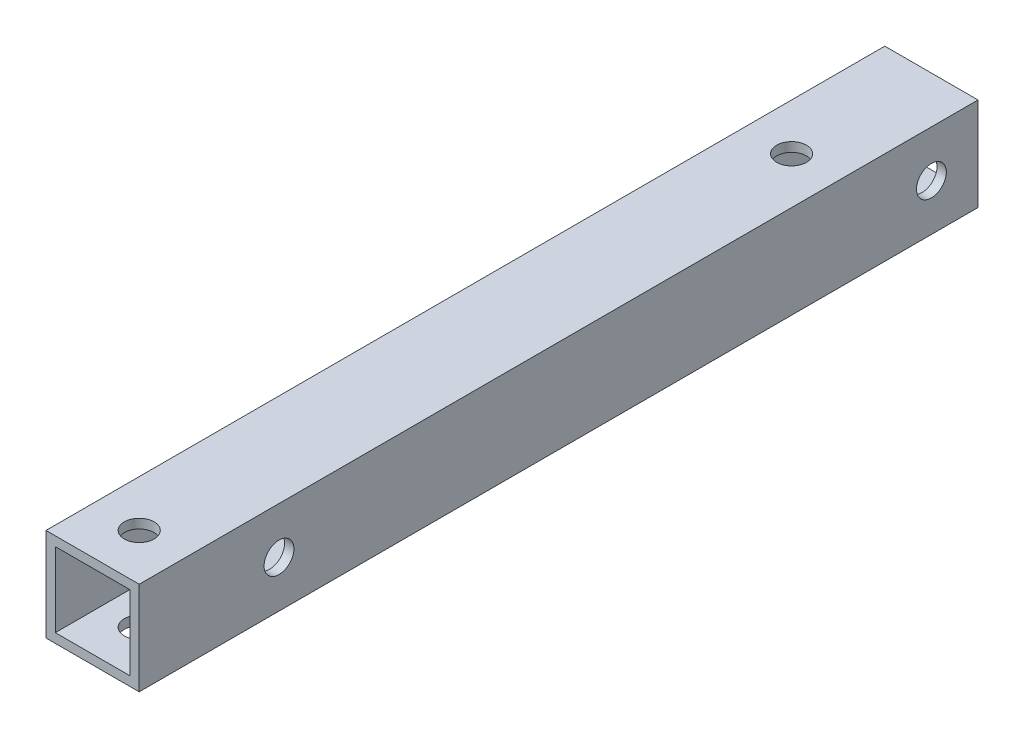
ISO-10303-21;
HEADER;
FILE_DESCRIPTION(('STEP AP214'),'2;1');
FILE_NAME('part.step','',(''),(''),'','','');
FILE_SCHEMA(('AUTOMOTIVE_DESIGN { 1 0 10303 214 1 1 1 1 }'));
ENDSEC;
DATA;
#1=APPLICATION_CONTEXT('core data for automotive mechanical design processes');
#2=APPLICATION_PROTOCOL_DEFINITION('international standard','automotive_design',2000,#1);
#3=PRODUCT_CONTEXT('',#1,'mechanical');
#4=PRODUCT('Part','Part','',(#3));
#5=PRODUCT_RELATED_PRODUCT_CATEGORY('part','',(#4));
#6=PRODUCT_DEFINITION_FORMATION('','',#4);
#7=PRODUCT_DEFINITION_CONTEXT('part definition',#1,'design');
#8=PRODUCT_DEFINITION('design','',#6,#7);
#9=PRODUCT_DEFINITION_SHAPE('','',#8);
#10=(LENGTH_UNIT() NAMED_UNIT(*) SI_UNIT(.MILLI.,.METRE.));
#11=(NAMED_UNIT(*) PLANE_ANGLE_UNIT() SI_UNIT($,.RADIAN.));
#12=(NAMED_UNIT(*) SI_UNIT($,.STERADIAN.) SOLID_ANGLE_UNIT());
#13=UNCERTAINTY_MEASURE_WITH_UNIT(LENGTH_MEASURE(1.E-05),#10,'distance_accuracy_value','');
#14=(GEOMETRIC_REPRESENTATION_CONTEXT(3) GLOBAL_UNCERTAINTY_ASSIGNED_CONTEXT((#13)) GLOBAL_UNIT_ASSIGNED_CONTEXT((#10,
#11,#12)) REPRESENTATION_CONTEXT('',''));
#15=CARTESIAN_POINT('',(0.,0.,0.));
#16=DIRECTION('',(0.,0.,1.));
#17=DIRECTION('',(1.,0.,0.));
#18=AXIS2_PLACEMENT_3D('',#15,#16,#17);
#19=CARTESIAN_POINT('',(0.,0.,90.));
#20=DIRECTION('',(0.,0.,1.));
#21=DIRECTION('',(1.,0.,0.));
#22=AXIS2_PLACEMENT_3D('',#19,#20,#21);
#23=PLANE('',#22);
#24=DIRECTION('',(0.,1.,0.));
#25=VECTOR('',#24,1.);
#26=CARTESIAN_POINT('',(5.,5.,90.));
#27=LINE('',#26,#25);
#28=CARTESIAN_POINT('',(5.,-5.,90.));
#29=VERTEX_POINT('',#28);
#30=CARTESIAN_POINT('',(5.,5.,90.));
#31=VERTEX_POINT('',#30);
#32=EDGE_CURVE('E140',#29,#31,#27,.T.);
#33=ORIENTED_EDGE('',*,*,#32,.T.);
#34=DIRECTION('',(-1.,0.,0.));
#35=VECTOR('',#34,1.);
#36=CARTESIAN_POINT('',(-5.,5.,90.));
#37=LINE('',#36,#35);
#38=CARTESIAN_POINT('',(-5.,5.,90.));
#39=VERTEX_POINT('',#38);
#40=EDGE_CURVE('E143',#31,#39,#37,.T.);
#41=ORIENTED_EDGE('',*,*,#40,.T.);
#42=DIRECTION('',(0.,-1.,0.));
#43=VECTOR('',#42,1.);
#44=CARTESIAN_POINT('',(-5.,5.,90.));
#45=LINE('',#44,#43);
#46=CARTESIAN_POINT('',(-5.,-5.,90.));
#47=VERTEX_POINT('',#46);
#48=EDGE_CURVE('E146',#39,#47,#45,.T.);
#49=ORIENTED_EDGE('',*,*,#48,.T.);
#50=DIRECTION('',(1.,0.,0.));
#51=VECTOR('',#50,1.);
#52=CARTESIAN_POINT('',(-5.,-5.,90.));
#53=LINE('',#52,#51);
#54=EDGE_CURVE('E148',#47,#29,#53,.T.);
#55=ORIENTED_EDGE('',*,*,#54,.T.);
#56=EDGE_LOOP('',(#33,#41,#49,#55));
#57=FACE_BOUND('',#56,.T.);
#58=DIRECTION('',(0.,-1.,0.));
#59=VECTOR('',#58,1.);
#60=CARTESIAN_POINT('',(-4.,4.,90.));
#61=LINE('',#60,#59);
#62=CARTESIAN_POINT('',(-4.,4.,90.));
#63=VERTEX_POINT('',#62);
#64=CARTESIAN_POINT('',(-4.,-4.,90.));
#65=VERTEX_POINT('',#64);
#66=EDGE_CURVE('E110',#63,#65,#61,.T.);
#67=ORIENTED_EDGE('',*,*,#66,.F.);
#68=DIRECTION('',(-1.,0.,0.));
#69=VECTOR('',#68,1.);
#70=CARTESIAN_POINT('',(-4.,4.,90.));
#71=LINE('',#70,#69);
#72=CARTESIAN_POINT('',(4.,4.,90.));
#73=VERTEX_POINT('',#72);
#74=EDGE_CURVE('E102',#73,#63,#71,.T.);
#75=ORIENTED_EDGE('',*,*,#74,.F.);
#76=DIRECTION('',(0.,1.,0.));
#77=VECTOR('',#76,1.);
#78=CARTESIAN_POINT('',(4.,4.,90.));
#79=LINE('',#78,#77);
#80=CARTESIAN_POINT('',(4.,-4.,90.));
#81=VERTEX_POINT('',#80);
#82=EDGE_CURVE('E124',#81,#73,#79,.T.);
#83=ORIENTED_EDGE('',*,*,#82,.F.);
#84=DIRECTION('',(1.,0.,0.));
#85=VECTOR('',#84,1.);
#86=CARTESIAN_POINT('',(-4.,-4.,90.));
#87=LINE('',#86,#85);
#88=EDGE_CURVE('E122',#65,#81,#87,.T.);
#89=ORIENTED_EDGE('',*,*,#88,.F.);
#90=EDGE_LOOP('',(#67,#75,#83,#89));
#91=FACE_BOUND('',#90,.T.);
#92=ADVANCED_FACE('F35',(#57,#91),#23,.T.);
#93=CARTESIAN_POINT('',(0.,0.,0.));
#94=DIRECTION('',(0.,0.,1.));
#95=DIRECTION('',(1.,0.,0.));
#96=AXIS2_PLACEMENT_3D('',#93,#94,#95);
#97=PLANE('',#96);
#98=DIRECTION('',(0.,1.,0.));
#99=VECTOR('',#98,1.);
#100=CARTESIAN_POINT('',(5.,5.,0.));
#101=LINE('',#100,#99);
#102=CARTESIAN_POINT('',(5.,-5.,0.));
#103=VERTEX_POINT('',#102);
#104=CARTESIAN_POINT('',(5.,5.,0.));
#105=VERTEX_POINT('',#104);
#106=EDGE_CURVE('E118',#103,#105,#101,.T.);
#107=ORIENTED_EDGE('',*,*,#106,.F.);
#108=DIRECTION('',(1.,0.,0.));
#109=VECTOR('',#108,1.);
#110=CARTESIAN_POINT('',(-5.,-5.,0.));
#111=LINE('',#110,#109);
#112=CARTESIAN_POINT('',(-5.,-5.,0.));
#113=VERTEX_POINT('',#112);
#114=EDGE_CURVE('E144',#113,#103,#111,.T.);
#115=ORIENTED_EDGE('',*,*,#114,.F.);
#116=DIRECTION('',(0.,-1.,0.));
#117=VECTOR('',#116,1.);
#118=CARTESIAN_POINT('',(-5.,5.,0.));
#119=LINE('',#118,#117);
#120=CARTESIAN_POINT('',(-5.,5.,0.));
#121=VERTEX_POINT('',#120);
#122=EDGE_CURVE('E155',#121,#113,#119,.T.);
#123=ORIENTED_EDGE('',*,*,#122,.F.);
#124=DIRECTION('',(-1.,0.,0.));
#125=VECTOR('',#124,1.);
#126=CARTESIAN_POINT('',(-5.,5.,0.));
#127=LINE('',#126,#125);
#128=EDGE_CURVE('E153',#105,#121,#127,.T.);
#129=ORIENTED_EDGE('',*,*,#128,.F.);
#130=EDGE_LOOP('',(#107,#115,#123,#129));
#131=FACE_BOUND('',#130,.T.);
#132=DIRECTION('',(-1.,0.,0.));
#133=VECTOR('',#132,1.);
#134=CARTESIAN_POINT('',(-4.,4.,0.));
#135=LINE('',#134,#133);
#136=CARTESIAN_POINT('',(4.,4.,0.));
#137=VERTEX_POINT('',#136);
#138=CARTESIAN_POINT('',(-4.,4.,0.));
#139=VERTEX_POINT('',#138);
#140=EDGE_CURVE('E60',#137,#139,#135,.T.);
#141=ORIENTED_EDGE('',*,*,#140,.T.);
#142=DIRECTION('',(0.,-1.,0.));
#143=VECTOR('',#142,1.);
#144=CARTESIAN_POINT('',(-4.,4.,0.));
#145=LINE('',#144,#143);
#146=CARTESIAN_POINT('',(-4.,-4.,0.));
#147=VERTEX_POINT('',#146);
#148=EDGE_CURVE('E117',#139,#147,#145,.T.);
#149=ORIENTED_EDGE('',*,*,#148,.T.);
#150=DIRECTION('',(1.,0.,0.));
#151=VECTOR('',#150,1.);
#152=CARTESIAN_POINT('',(-4.,-4.,0.));
#153=LINE('',#152,#151);
#154=CARTESIAN_POINT('',(4.,-4.,0.));
#155=VERTEX_POINT('',#154);
#156=EDGE_CURVE('E132',#147,#155,#153,.T.);
#157=ORIENTED_EDGE('',*,*,#156,.T.);
#158=DIRECTION('',(0.,1.,0.));
#159=VECTOR('',#158,1.);
#160=CARTESIAN_POINT('',(4.,4.,0.));
#161=LINE('',#160,#159);
#162=EDGE_CURVE('E111',#155,#137,#161,.T.);
#163=ORIENTED_EDGE('',*,*,#162,.T.);
#164=EDGE_LOOP('',(#141,#149,#157,#163));
#165=FACE_BOUND('',#164,.T.);
#166=ADVANCED_FACE('F246',(#131,#165),#97,.F.);
#167=CARTESIAN_POINT('',(5.,5.,90.));
#168=DIRECTION('',(-1.,0.,0.));
#169=DIRECTION('',(0.,-1.,0.));
#170=AXIS2_PLACEMENT_3D('',#167,#168,#169);
#171=PLANE('',#170);
#172=CARTESIAN_POINT('',(5.,0.,75.));
#173=DIRECTION('',(1.,0.,0.));
#174=DIRECTION('',(0.,1.,0.));
#175=AXIS2_PLACEMENT_3D('',#172,#173,#174);
#176=CIRCLE('',#175,1.60000000000001);
#177=CARTESIAN_POINT('',(5.,1.60000000000001,75.));
#178=VERTEX_POINT('',#177);
#179=EDGE_CURVE('E200',#178,#178,#176,.T.);
#180=ORIENTED_EDGE('',*,*,#179,.F.);
#181=EDGE_LOOP('',(#180));
#182=FACE_BOUND('',#181,.T.);
#183=CARTESIAN_POINT('',(5.,0.,5.));
#184=DIRECTION('',(1.,0.,0.));
#185=DIRECTION('',(0.,1.,0.));
#186=AXIS2_PLACEMENT_3D('',#183,#184,#185);
#187=CIRCLE('',#186,1.60000000000001);
#188=CARTESIAN_POINT('',(5.,1.60000000000001,5.));
#189=VERTEX_POINT('',#188);
#190=EDGE_CURVE('E197',#189,#189,#187,.T.);
#191=ORIENTED_EDGE('',*,*,#190,.F.);
#192=EDGE_LOOP('',(#191));
#193=FACE_BOUND('',#192,.T.);
#194=ORIENTED_EDGE('',*,*,#106,.T.);
#195=DIRECTION('',(0.,0.,-1.));
#196=VECTOR('',#195,1.);
#197=CARTESIAN_POINT('',(5.,5.,90.));
#198=LINE('',#197,#196);
#199=EDGE_CURVE('E11',#31,#105,#198,.T.);
#200=ORIENTED_EDGE('',*,*,#199,.F.);
#201=ORIENTED_EDGE('',*,*,#32,.F.);
#202=DIRECTION('',(0.,0.,-1.));
#203=VECTOR('',#202,1.);
#204=CARTESIAN_POINT('',(5.,-5.,90.));
#205=LINE('',#204,#203);
#206=EDGE_CURVE('E150',#29,#103,#205,.T.);
#207=ORIENTED_EDGE('',*,*,#206,.T.);
#208=EDGE_LOOP('',(#194,#200,#201,#207));
#209=FACE_BOUND('',#208,.T.);
#210=ADVANCED_FACE('F37',(#182,#193,#209),#171,.F.);
#211=CARTESIAN_POINT('',(-5.,5.,90.));
#212=DIRECTION('',(0.,-1.,0.));
#213=DIRECTION('',(0.,0.,-1.));
#214=AXIS2_PLACEMENT_3D('',#211,#212,#213);
#215=PLANE('',#214);
#216=CARTESIAN_POINT('',(0.,5.,15.));
#217=DIRECTION('',(0.,1.,0.));
#218=DIRECTION('',(0.,0.,1.));
#219=AXIS2_PLACEMENT_3D('',#216,#217,#218);
#220=CIRCLE('',#219,1.6);
#221=CARTESIAN_POINT('',(0.,5.,16.6));
#222=VERTEX_POINT('',#221);
#223=EDGE_CURVE('E181',#222,#222,#220,.T.);
#224=ORIENTED_EDGE('',*,*,#223,.F.);
#225=EDGE_LOOP('',(#224));
#226=FACE_BOUND('',#225,.T.);
#227=CARTESIAN_POINT('',(0.,5.,85.));
#228=DIRECTION('',(0.,1.,0.));
#229=DIRECTION('',(0.,0.,1.));
#230=AXIS2_PLACEMENT_3D('',#227,#228,#229);
#231=CIRCLE('',#230,1.6);
#232=CARTESIAN_POINT('',(0.,5.,86.6));
#233=VERTEX_POINT('',#232);
#234=EDGE_CURVE('E191',#233,#233,#231,.T.);
#235=ORIENTED_EDGE('',*,*,#234,.F.);
#236=EDGE_LOOP('',(#235));
#237=FACE_BOUND('',#236,.T.);
#238=ORIENTED_EDGE('',*,*,#128,.T.);
#239=DIRECTION('',(0.,0.,-1.));
#240=VECTOR('',#239,1.);
#241=CARTESIAN_POINT('',(-5.,5.,90.));
#242=LINE('',#241,#240);
#243=EDGE_CURVE('E44',#39,#121,#242,.T.);
#244=ORIENTED_EDGE('',*,*,#243,.F.);
#245=ORIENTED_EDGE('',*,*,#40,.F.);
#246=ORIENTED_EDGE('',*,*,#199,.T.);
#247=EDGE_LOOP('',(#238,#244,#245,#246));
#248=FACE_BOUND('',#247,.T.);
#249=ADVANCED_FACE('F233',(#226,#237,#248),#215,.F.);
#250=CARTESIAN_POINT('',(-5.,5.,90.));
#251=DIRECTION('',(1.,0.,0.));
#252=DIRECTION('',(0.,1.,0.));
#253=AXIS2_PLACEMENT_3D('',#250,#251,#252);
#254=PLANE('',#253);
#255=CARTESIAN_POINT('',(-5.,0.,75.));
#256=DIRECTION('',(1.,0.,0.));
#257=DIRECTION('',(0.,1.,0.));
#258=AXIS2_PLACEMENT_3D('',#255,#256,#257);
#259=CIRCLE('',#258,1.60000000000001);
#260=CARTESIAN_POINT('',(-5.,1.6,75.));
#261=VERTEX_POINT('',#260);
#262=EDGE_CURVE('E169',#261,#261,#259,.T.);
#263=ORIENTED_EDGE('',*,*,#262,.T.);
#264=EDGE_LOOP('',(#263));
#265=FACE_BOUND('',#264,.T.);
#266=CARTESIAN_POINT('',(-5.,0.,5.));
#267=DIRECTION('',(1.,0.,0.));
#268=DIRECTION('',(0.,1.,0.));
#269=AXIS2_PLACEMENT_3D('',#266,#267,#268);
#270=CIRCLE('',#269,1.60000000000001);
#271=CARTESIAN_POINT('',(-5.,1.6,5.));
#272=VERTEX_POINT('',#271);
#273=EDGE_CURVE('E203',#272,#272,#270,.T.);
#274=ORIENTED_EDGE('',*,*,#273,.T.);
#275=EDGE_LOOP('',(#274));
#276=FACE_BOUND('',#275,.T.);
#277=ORIENTED_EDGE('',*,*,#122,.T.);
#278=DIRECTION('',(0.,0.,-1.));
#279=VECTOR('',#278,1.);
#280=CARTESIAN_POINT('',(-5.,-5.,90.));
#281=LINE('',#280,#279);
#282=EDGE_CURVE('E160',#47,#113,#281,.T.);
#283=ORIENTED_EDGE('',*,*,#282,.F.);
#284=ORIENTED_EDGE('',*,*,#48,.F.);
#285=ORIENTED_EDGE('',*,*,#243,.T.);
#286=EDGE_LOOP('',(#277,#283,#284,#285));
#287=FACE_BOUND('',#286,.T.);
#288=ADVANCED_FACE('F229',(#265,#276,#287),#254,.F.);
#289=CARTESIAN_POINT('',(-5.,-5.,90.));
#290=DIRECTION('',(0.,1.,0.));
#291=DIRECTION('',(0.,0.,1.));
#292=AXIS2_PLACEMENT_3D('',#289,#290,#291);
#293=PLANE('',#292);
#294=CARTESIAN_POINT('',(0.,-5.,15.));
#295=DIRECTION('',(0.,1.,0.));
#296=DIRECTION('',(0.,0.,1.));
#297=AXIS2_PLACEMENT_3D('',#294,#295,#296);
#298=CIRCLE('',#297,1.6);
#299=CARTESIAN_POINT('',(0.,-5.,16.6));
#300=VERTEX_POINT('',#299);
#301=EDGE_CURVE('E175',#300,#300,#298,.T.);
#302=ORIENTED_EDGE('',*,*,#301,.T.);
#303=EDGE_LOOP('',(#302));
#304=FACE_BOUND('',#303,.T.);
#305=CARTESIAN_POINT('',(0.,-5.,85.));
#306=DIRECTION('',(0.,1.,0.));
#307=DIRECTION('',(0.,0.,1.));
#308=AXIS2_PLACEMENT_3D('',#305,#306,#307);
#309=CIRCLE('',#308,1.6);
#310=CARTESIAN_POINT('',(0.,-5.,86.6));
#311=VERTEX_POINT('',#310);
#312=EDGE_CURVE('E186',#311,#311,#309,.T.);
#313=ORIENTED_EDGE('',*,*,#312,.T.);
#314=EDGE_LOOP('',(#313));
#315=FACE_BOUND('',#314,.T.);
#316=ORIENTED_EDGE('',*,*,#114,.T.);
#317=ORIENTED_EDGE('',*,*,#206,.F.);
#318=ORIENTED_EDGE('',*,*,#54,.F.);
#319=ORIENTED_EDGE('',*,*,#282,.T.);
#320=EDGE_LOOP('',(#316,#317,#318,#319));
#321=FACE_BOUND('',#320,.T.);
#322=ADVANCED_FACE('F232',(#304,#315,#321),#293,.F.);
#323=CARTESIAN_POINT('',(-4.,4.,90.));
#324=DIRECTION('',(0.,-1.,0.));
#325=DIRECTION('',(0.,0.,-1.));
#326=AXIS2_PLACEMENT_3D('',#323,#324,#325);
#327=PLANE('',#326);
#328=CARTESIAN_POINT('',(0.,4.,15.));
#329=DIRECTION('',(0.,-1.,0.));
#330=DIRECTION('',(0.,0.,-1.));
#331=AXIS2_PLACEMENT_3D('',#328,#329,#330);
#332=CIRCLE('',#331,1.6);
#333=CARTESIAN_POINT('',(0.,4.,13.4));
#334=VERTEX_POINT('',#333);
#335=EDGE_CURVE('E194',#334,#334,#332,.T.);
#336=ORIENTED_EDGE('',*,*,#335,.F.);
#337=EDGE_LOOP('',(#336));
#338=FACE_BOUND('',#337,.T.);
#339=CARTESIAN_POINT('',(0.,4.,85.));
#340=DIRECTION('',(0.,-1.,0.));
#341=DIRECTION('',(0.,0.,-1.));
#342=AXIS2_PLACEMENT_3D('',#339,#340,#341);
#343=CIRCLE('',#342,1.6);
#344=CARTESIAN_POINT('',(0.,4.,83.4));
#345=VERTEX_POINT('',#344);
#346=EDGE_CURVE('E174',#345,#345,#343,.T.);
#347=ORIENTED_EDGE('',*,*,#346,.F.);
#348=EDGE_LOOP('',(#347));
#349=FACE_BOUND('',#348,.T.);
#350=ORIENTED_EDGE('',*,*,#140,.F.);
#351=DIRECTION('',(0.,0.,-1.));
#352=VECTOR('',#351,1.);
#353=CARTESIAN_POINT('',(4.,4.,90.));
#354=LINE('',#353,#352);
#355=EDGE_CURVE('E106',#73,#137,#354,.T.);
#356=ORIENTED_EDGE('',*,*,#355,.F.);
#357=ORIENTED_EDGE('',*,*,#74,.T.);
#358=DIRECTION('',(0.,0.,-1.));
#359=VECTOR('',#358,1.);
#360=CARTESIAN_POINT('',(-4.,4.,90.));
#361=LINE('',#360,#359);
#362=EDGE_CURVE('E105',#63,#139,#361,.T.);
#363=ORIENTED_EDGE('',*,*,#362,.T.);
#364=EDGE_LOOP('',(#350,#356,#357,#363));
#365=FACE_BOUND('',#364,.T.);
#366=ADVANCED_FACE('F104',(#338,#349,#365),#327,.T.);
#367=CARTESIAN_POINT('',(-4.,4.,90.));
#368=DIRECTION('',(1.,0.,0.));
#369=DIRECTION('',(0.,1.,0.));
#370=AXIS2_PLACEMENT_3D('',#367,#368,#369);
#371=PLANE('',#370);
#372=CARTESIAN_POINT('',(-4.,0.,75.));
#373=DIRECTION('',(1.,0.,0.));
#374=DIRECTION('',(0.,1.,0.));
#375=AXIS2_PLACEMENT_3D('',#372,#373,#374);
#376=CIRCLE('',#375,1.60000000000001);
#377=CARTESIAN_POINT('',(-4.,1.6,75.));
#378=VERTEX_POINT('',#377);
#379=EDGE_CURVE('E130',#378,#378,#376,.T.);
#380=ORIENTED_EDGE('',*,*,#379,.F.);
#381=EDGE_LOOP('',(#380));
#382=FACE_BOUND('',#381,.T.);
#383=CARTESIAN_POINT('',(-4.,0.,5.));
#384=DIRECTION('',(1.,0.,0.));
#385=DIRECTION('',(0.,1.,0.));
#386=AXIS2_PLACEMENT_3D('',#383,#384,#385);
#387=CIRCLE('',#386,1.60000000000001);
#388=CARTESIAN_POINT('',(-4.,1.6,5.));
#389=VERTEX_POINT('',#388);
#390=EDGE_CURVE('E168',#389,#389,#387,.T.);
#391=ORIENTED_EDGE('',*,*,#390,.F.);
#392=EDGE_LOOP('',(#391));
#393=FACE_BOUND('',#392,.T.);
#394=ORIENTED_EDGE('',*,*,#148,.F.);
#395=ORIENTED_EDGE('',*,*,#362,.F.);
#396=ORIENTED_EDGE('',*,*,#66,.T.);
#397=DIRECTION('',(0.,0.,-1.));
#398=VECTOR('',#397,1.);
#399=CARTESIAN_POINT('',(-4.,-4.,90.));
#400=LINE('',#399,#398);
#401=EDGE_CURVE('E119',#65,#147,#400,.T.);
#402=ORIENTED_EDGE('',*,*,#401,.T.);
#403=EDGE_LOOP('',(#394,#395,#396,#402));
#404=FACE_BOUND('',#403,.T.);
#405=ADVANCED_FACE('F114',(#382,#393,#404),#371,.T.);
#406=CARTESIAN_POINT('',(-4.,-4.,90.));
#407=DIRECTION('',(0.,1.,0.));
#408=DIRECTION('',(-1.,0.,0.));
#409=AXIS2_PLACEMENT_3D('',#406,#407,#408);
#410=PLANE('',#409);
#411=CARTESIAN_POINT('',(0.,-4.,15.));
#412=DIRECTION('',(0.,1.,0.));
#413=DIRECTION('',(-1.,0.,0.));
#414=AXIS2_PLACEMENT_3D('',#411,#412,#413);
#415=CIRCLE('',#414,1.6);
#416=CARTESIAN_POINT('',(-1.6,-4.,15.));
#417=VERTEX_POINT('',#416);
#418=EDGE_CURVE('E39',#417,#417,#415,.T.);
#419=ORIENTED_EDGE('',*,*,#418,.F.);
#420=EDGE_LOOP('',(#419));
#421=FACE_BOUND('',#420,.T.);
#422=CARTESIAN_POINT('',(0.,-4.,85.));
#423=DIRECTION('',(0.,1.,0.));
#424=DIRECTION('',(-1.,0.,0.));
#425=AXIS2_PLACEMENT_3D('',#422,#423,#424);
#426=CIRCLE('',#425,1.6);
#427=CARTESIAN_POINT('',(-1.6,-4.,85.));
#428=VERTEX_POINT('',#427);
#429=EDGE_CURVE('E172',#428,#428,#426,.T.);
#430=ORIENTED_EDGE('',*,*,#429,.F.);
#431=EDGE_LOOP('',(#430));
#432=FACE_BOUND('',#431,.T.);
#433=ORIENTED_EDGE('',*,*,#156,.F.);
#434=ORIENTED_EDGE('',*,*,#401,.F.);
#435=ORIENTED_EDGE('',*,*,#88,.T.);
#436=DIRECTION('',(0.,0.,-1.));
#437=VECTOR('',#436,1.);
#438=CARTESIAN_POINT('',(4.,-4.,90.));
#439=LINE('',#438,#437);
#440=EDGE_CURVE('E52',#81,#155,#439,.T.);
#441=ORIENTED_EDGE('',*,*,#440,.T.);
#442=EDGE_LOOP('',(#433,#434,#435,#441));
#443=FACE_BOUND('',#442,.T.);
#444=ADVANCED_FACE('F217',(#421,#432,#443),#410,.T.);
#445=CARTESIAN_POINT('',(4.,4.,90.));
#446=DIRECTION('',(-1.,0.,0.));
#447=DIRECTION('',(0.,-1.,0.));
#448=AXIS2_PLACEMENT_3D('',#445,#446,#447);
#449=PLANE('',#448);
#450=CARTESIAN_POINT('',(4.,0.,75.));
#451=DIRECTION('',(-1.,0.,0.));
#452=DIRECTION('',(0.,-1.,0.));
#453=AXIS2_PLACEMENT_3D('',#450,#451,#452);
#454=CIRCLE('',#453,1.60000000000001);
#455=CARTESIAN_POINT('',(3.99999999999999,1.60000000000001,75.));
#456=VERTEX_POINT('',#455);
#457=EDGE_CURVE('E170',#456,#456,#454,.T.);
#458=ORIENTED_EDGE('',*,*,#457,.F.);
#459=EDGE_LOOP('',(#458));
#460=FACE_BOUND('',#459,.T.);
#461=CARTESIAN_POINT('',(4.,0.,5.));
#462=DIRECTION('',(-1.,0.,0.));
#463=DIRECTION('',(0.,-1.,0.));
#464=AXIS2_PLACEMENT_3D('',#461,#462,#463);
#465=CIRCLE('',#464,1.60000000000001);
#466=CARTESIAN_POINT('',(3.99999999999999,1.60000000000001,5.));
#467=VERTEX_POINT('',#466);
#468=EDGE_CURVE('E165',#467,#467,#465,.T.);
#469=ORIENTED_EDGE('',*,*,#468,.F.);
#470=EDGE_LOOP('',(#469));
#471=FACE_BOUND('',#470,.T.);
#472=ORIENTED_EDGE('',*,*,#162,.F.);
#473=ORIENTED_EDGE('',*,*,#440,.F.);
#474=ORIENTED_EDGE('',*,*,#82,.T.);
#475=ORIENTED_EDGE('',*,*,#355,.T.);
#476=EDGE_LOOP('',(#472,#473,#474,#475));
#477=FACE_BOUND('',#476,.T.);
#478=ADVANCED_FACE('F328',(#460,#471,#477),#449,.T.);
#479=CARTESIAN_POINT('',(-5.,0.,5.));
#480=DIRECTION('',(1.,0.,0.));
#481=DIRECTION('',(0.,1.,0.));
#482=AXIS2_PLACEMENT_3D('',#479,#480,#481);
#483=CYLINDRICAL_SURFACE('',#482,1.60000000000001);
#484=CARTESIAN_POINT('',(3.99999999999999,1.60000000000001,5.));
#485=CARTESIAN_POINT('',(4.01041666666666,1.60000000000001,5.));
#486=CARTESIAN_POINT('',(4.02083333333333,1.60000000000001,5.));
#487=CARTESIAN_POINT('',(4.04166666666666,1.60000000000001,5.));
#488=CARTESIAN_POINT('',(4.05208333333333,1.60000000000001,5.));
#489=CARTESIAN_POINT('',(4.07291666666666,1.60000000000001,5.));
#490=CARTESIAN_POINT('',(4.08333333333333,1.60000000000001,5.));
#491=CARTESIAN_POINT('',(4.10416666666666,1.60000000000001,5.));
#492=CARTESIAN_POINT('',(4.11458333333333,1.60000000000001,5.));
#493=CARTESIAN_POINT('',(4.13541666666666,1.60000000000001,5.));
#494=CARTESIAN_POINT('',(4.14583333333333,1.60000000000001,5.));
#495=CARTESIAN_POINT('',(4.16666666666666,1.60000000000001,5.));
#496=CARTESIAN_POINT('',(4.17708333333333,1.60000000000001,5.));
#497=CARTESIAN_POINT('',(4.19791666666666,1.60000000000001,5.));
#498=CARTESIAN_POINT('',(4.20833333333333,1.60000000000001,5.));
#499=CARTESIAN_POINT('',(4.22916666666666,1.60000000000001,5.));
#500=CARTESIAN_POINT('',(4.23958333333333,1.60000000000001,5.));
#501=CARTESIAN_POINT('',(4.26041666666666,1.60000000000001,5.));
#502=CARTESIAN_POINT('',(4.27083333333333,1.60000000000001,5.));
#503=CARTESIAN_POINT('',(4.29166666666666,1.60000000000001,5.));
#504=CARTESIAN_POINT('',(4.30208333333333,1.60000000000001,5.));
#505=CARTESIAN_POINT('',(4.32291666666666,1.60000000000001,5.));
#506=CARTESIAN_POINT('',(4.33333333333333,1.60000000000001,5.));
#507=CARTESIAN_POINT('',(4.35416666666666,1.60000000000001,5.));
#508=CARTESIAN_POINT('',(4.36458333333333,1.60000000000001,5.));
#509=CARTESIAN_POINT('',(4.38541666666666,1.60000000000001,5.));
#510=CARTESIAN_POINT('',(4.39583333333333,1.60000000000001,5.));
#511=CARTESIAN_POINT('',(4.41666666666666,1.60000000000001,5.));
#512=CARTESIAN_POINT('',(4.42708333333333,1.60000000000001,5.));
#513=CARTESIAN_POINT('',(4.44791666666666,1.60000000000001,5.));
#514=CARTESIAN_POINT('',(4.45833333333333,1.60000000000001,5.));
#515=CARTESIAN_POINT('',(4.47916666666666,1.60000000000001,5.));
#516=CARTESIAN_POINT('',(4.48958333333333,1.60000000000001,5.));
#517=CARTESIAN_POINT('',(4.51041666666666,1.60000000000001,5.));
#518=CARTESIAN_POINT('',(4.52083333333333,1.60000000000001,5.));
#519=CARTESIAN_POINT('',(4.54166666666666,1.60000000000001,5.));
#520=CARTESIAN_POINT('',(4.55208333333333,1.60000000000001,5.));
#521=CARTESIAN_POINT('',(4.57291666666666,1.60000000000001,5.));
#522=CARTESIAN_POINT('',(4.58333333333333,1.60000000000001,5.));
#523=CARTESIAN_POINT('',(4.60416666666666,1.60000000000001,5.));
#524=CARTESIAN_POINT('',(4.61458333333333,1.60000000000001,5.));
#525=CARTESIAN_POINT('',(4.63541666666666,1.60000000000001,5.));
#526=CARTESIAN_POINT('',(4.64583333333333,1.60000000000001,5.));
#527=CARTESIAN_POINT('',(4.66666666666666,1.60000000000001,5.));
#528=CARTESIAN_POINT('',(4.67708333333333,1.60000000000001,5.));
#529=CARTESIAN_POINT('',(4.69791666666666,1.60000000000001,5.));
#530=CARTESIAN_POINT('',(4.70833333333333,1.60000000000001,5.));
#531=CARTESIAN_POINT('',(4.72916666666666,1.60000000000001,5.));
#532=CARTESIAN_POINT('',(4.73958333333333,1.60000000000001,5.));
#533=CARTESIAN_POINT('',(4.76041666666667,1.60000000000001,5.));
#534=CARTESIAN_POINT('',(4.77083333333333,1.60000000000001,5.));
#535=CARTESIAN_POINT('',(4.79166666666667,1.60000000000001,5.));
#536=CARTESIAN_POINT('',(4.80208333333333,1.60000000000001,5.));
#537=CARTESIAN_POINT('',(4.82291666666667,1.60000000000001,5.));
#538=CARTESIAN_POINT('',(4.83333333333333,1.60000000000001,5.));
#539=CARTESIAN_POINT('',(4.85416666666667,1.60000000000001,5.));
#540=CARTESIAN_POINT('',(4.86458333333333,1.60000000000001,5.));
#541=CARTESIAN_POINT('',(4.88541666666667,1.60000000000001,5.));
#542=CARTESIAN_POINT('',(4.89583333333333,1.60000000000001,5.));
#543=CARTESIAN_POINT('',(4.91666666666667,1.60000000000001,5.));
#544=CARTESIAN_POINT('',(4.92708333333333,1.60000000000001,5.));
#545=CARTESIAN_POINT('',(4.94791666666667,1.60000000000001,5.));
#546=CARTESIAN_POINT('',(4.95833333333333,1.60000000000001,5.));
#547=CARTESIAN_POINT('',(4.97916666666667,1.60000000000001,5.));
#548=CARTESIAN_POINT('',(4.98958333333333,1.60000000000001,5.));
#549=CARTESIAN_POINT('',(5.,1.60000000000001,5.));
#550=B_SPLINE_CURVE_WITH_KNOTS('',3,(#484,#485,#486,#487,#488,#489,#490,#491,#492,#493,#494,
#495,#496,#497,#498,#499,#500,#501,#502,#503,#504,#505,#506,#507,#508,#509,#510,#511,#512,#513,
#514,#515,#516,#517,#518,#519,#520,#521,#522,#523,#524,#525,#526,#527,#528,#529,#530,#531,#532,
#533,#534,#535,#536,#537,#538,#539,#540,#541,#542,#543,#544,#545,#546,#547,#548,#549),
.UNSPECIFIED.,.F.,.F.,(4,2,2,2,2,2,2,2,2,2,2,2,2,2,2,2,2,2,2,2,2,2,2,2,2,2,2,2,2,2,2,2,4),(0.,
0.03125,0.0625000000000001,0.0937500000000001,0.125,0.15625,0.1875,0.21875,0.25,
0.281250000000002,0.312500000000002,0.343750000000002,0.375000000000002,0.406250000000002,
0.437500000000002,0.468750000000002,0.500000000000002,0.531250000000002,0.562500000000002,
0.593750000000002,0.625000000000002,0.656250000000002,0.687500000000002,0.718750000000002,
0.750000000000004,0.781250000000004,0.812500000000004,0.843750000000004,0.875000000000004,
0.906250000000004,0.937500000000004,0.968750000000004,1.),.UNSPECIFIED.);
#551=EDGE_CURVE('BSEAM226',#467,#189,#550,.T.);
#552=ORIENTED_EDGE('',*,*,#468,.T.);
#553=ORIENTED_EDGE('',*,*,#190,.T.);
#554=ORIENTED_EDGE('',*,*,#551,.T.);
#555=ORIENTED_EDGE('',*,*,#551,.F.);
#556=EDGE_LOOP('',(#552,#554,#553,#555));
#557=FACE_BOUND('',#556,.T.);
#558=ADVANCED_FACE('F226',(#557),#483,.F.);
#559=CARTESIAN_POINT('',(-5.,0.,75.));
#560=DIRECTION('',(1.,0.,0.));
#561=DIRECTION('',(0.,1.,0.));
#562=AXIS2_PLACEMENT_3D('',#559,#560,#561);
#563=CYLINDRICAL_SURFACE('',#562,1.60000000000001);
#564=CARTESIAN_POINT('',(3.99999999999999,1.60000000000001,75.));
#565=CARTESIAN_POINT('',(4.01041666666666,1.60000000000001,75.));
#566=CARTESIAN_POINT('',(4.02083333333333,1.60000000000001,75.));
#567=CARTESIAN_POINT('',(4.04166666666666,1.60000000000001,75.));
#568=CARTESIAN_POINT('',(4.05208333333333,1.60000000000001,75.));
#569=CARTESIAN_POINT('',(4.07291666666666,1.60000000000001,75.));
#570=CARTESIAN_POINT('',(4.08333333333333,1.60000000000001,75.));
#571=CARTESIAN_POINT('',(4.10416666666666,1.60000000000001,75.));
#572=CARTESIAN_POINT('',(4.11458333333333,1.60000000000001,75.));
#573=CARTESIAN_POINT('',(4.13541666666666,1.60000000000001,75.));
#574=CARTESIAN_POINT('',(4.14583333333333,1.60000000000001,75.));
#575=CARTESIAN_POINT('',(4.16666666666666,1.60000000000001,75.));
#576=CARTESIAN_POINT('',(4.17708333333333,1.60000000000001,75.));
#577=CARTESIAN_POINT('',(4.19791666666666,1.60000000000001,75.));
#578=CARTESIAN_POINT('',(4.20833333333333,1.60000000000001,75.));
#579=CARTESIAN_POINT('',(4.22916666666666,1.60000000000001,75.));
#580=CARTESIAN_POINT('',(4.23958333333333,1.60000000000001,75.));
#581=CARTESIAN_POINT('',(4.26041666666666,1.60000000000001,75.));
#582=CARTESIAN_POINT('',(4.27083333333333,1.60000000000001,75.));
#583=CARTESIAN_POINT('',(4.29166666666666,1.60000000000001,75.));
#584=CARTESIAN_POINT('',(4.30208333333333,1.60000000000001,75.));
#585=CARTESIAN_POINT('',(4.32291666666666,1.60000000000001,75.));
#586=CARTESIAN_POINT('',(4.33333333333333,1.60000000000001,75.));
#587=CARTESIAN_POINT('',(4.35416666666666,1.60000000000001,75.));
#588=CARTESIAN_POINT('',(4.36458333333333,1.60000000000001,75.));
#589=CARTESIAN_POINT('',(4.38541666666666,1.60000000000001,75.));
#590=CARTESIAN_POINT('',(4.39583333333333,1.60000000000001,75.));
#591=CARTESIAN_POINT('',(4.41666666666666,1.60000000000001,75.));
#592=CARTESIAN_POINT('',(4.42708333333333,1.60000000000001,75.));
#593=CARTESIAN_POINT('',(4.44791666666666,1.60000000000001,75.));
#594=CARTESIAN_POINT('',(4.45833333333333,1.60000000000001,75.));
#595=CARTESIAN_POINT('',(4.47916666666666,1.60000000000001,75.));
#596=CARTESIAN_POINT('',(4.48958333333333,1.60000000000001,75.));
#597=CARTESIAN_POINT('',(4.51041666666666,1.60000000000001,75.));
#598=CARTESIAN_POINT('',(4.52083333333333,1.60000000000001,75.));
#599=CARTESIAN_POINT('',(4.54166666666666,1.60000000000001,75.));
#600=CARTESIAN_POINT('',(4.55208333333333,1.60000000000001,75.));
#601=CARTESIAN_POINT('',(4.57291666666666,1.60000000000001,75.));
#602=CARTESIAN_POINT('',(4.58333333333333,1.60000000000001,75.));
#603=CARTESIAN_POINT('',(4.60416666666666,1.60000000000001,75.));
#604=CARTESIAN_POINT('',(4.61458333333333,1.60000000000001,75.));
#605=CARTESIAN_POINT('',(4.63541666666666,1.60000000000001,75.));
#606=CARTESIAN_POINT('',(4.64583333333333,1.60000000000001,75.));
#607=CARTESIAN_POINT('',(4.66666666666666,1.60000000000001,75.));
#608=CARTESIAN_POINT('',(4.67708333333333,1.60000000000001,75.));
#609=CARTESIAN_POINT('',(4.69791666666666,1.60000000000001,75.));
#610=CARTESIAN_POINT('',(4.70833333333333,1.60000000000001,75.));
#611=CARTESIAN_POINT('',(4.72916666666666,1.60000000000001,75.));
#612=CARTESIAN_POINT('',(4.73958333333333,1.60000000000001,75.));
#613=CARTESIAN_POINT('',(4.76041666666667,1.60000000000001,75.));
#614=CARTESIAN_POINT('',(4.77083333333333,1.60000000000001,75.));
#615=CARTESIAN_POINT('',(4.79166666666667,1.60000000000001,75.));
#616=CARTESIAN_POINT('',(4.80208333333333,1.60000000000001,75.));
#617=CARTESIAN_POINT('',(4.82291666666667,1.60000000000001,75.));
#618=CARTESIAN_POINT('',(4.83333333333333,1.60000000000001,75.));
#619=CARTESIAN_POINT('',(4.85416666666667,1.60000000000001,75.));
#620=CARTESIAN_POINT('',(4.86458333333333,1.60000000000001,75.));
#621=CARTESIAN_POINT('',(4.88541666666667,1.60000000000001,75.));
#622=CARTESIAN_POINT('',(4.89583333333333,1.60000000000001,75.));
#623=CARTESIAN_POINT('',(4.91666666666667,1.60000000000001,75.));
#624=CARTESIAN_POINT('',(4.92708333333333,1.60000000000001,75.));
#625=CARTESIAN_POINT('',(4.94791666666667,1.60000000000001,75.));
#626=CARTESIAN_POINT('',(4.95833333333333,1.60000000000001,75.));
#627=CARTESIAN_POINT('',(4.97916666666667,1.60000000000001,75.));
#628=CARTESIAN_POINT('',(4.98958333333333,1.60000000000001,75.));
#629=CARTESIAN_POINT('',(5.,1.60000000000001,75.));
#630=B_SPLINE_CURVE_WITH_KNOTS('',3,(#564,#565,#566,#567,#568,#569,#570,#571,#572,#573,#574,
#575,#576,#577,#578,#579,#580,#581,#582,#583,#584,#585,#586,#587,#588,#589,#590,#591,#592,#593,
#594,#595,#596,#597,#598,#599,#600,#601,#602,#603,#604,#605,#606,#607,#608,#609,#610,#611,#612,
#613,#614,#615,#616,#617,#618,#619,#620,#621,#622,#623,#624,#625,#626,#627,#628,#629),
.UNSPECIFIED.,.F.,.F.,(4,2,2,2,2,2,2,2,2,2,2,2,2,2,2,2,2,2,2,2,2,2,2,2,2,2,2,2,2,2,2,2,4),(0.,
0.03125,0.0625000000000001,0.0937500000000001,0.125,0.15625,0.1875,0.21875,0.25,
0.281250000000002,0.312500000000002,0.343750000000002,0.375000000000002,0.406250000000002,
0.437500000000002,0.468750000000002,0.500000000000002,0.531250000000002,0.562500000000002,
0.593750000000002,0.625000000000002,0.656250000000002,0.687500000000002,0.718750000000002,
0.750000000000004,0.781250000000004,0.812500000000004,0.843750000000004,0.875000000000004,
0.906250000000004,0.937500000000004,0.968750000000004,1.),.UNSPECIFIED.);
#631=EDGE_CURVE('BSEAM224',#456,#178,#630,.T.);
#632=ORIENTED_EDGE('',*,*,#457,.T.);
#633=ORIENTED_EDGE('',*,*,#179,.T.);
#634=ORIENTED_EDGE('',*,*,#631,.T.);
#635=ORIENTED_EDGE('',*,*,#631,.F.);
#636=EDGE_LOOP('',(#632,#634,#633,#635));
#637=FACE_BOUND('',#636,.T.);
#638=ADVANCED_FACE('F224',(#637),#563,.F.);
#639=CARTESIAN_POINT('',(-4.,1.6,5.));
#640=CARTESIAN_POINT('',(-4.01041666666667,1.6,5.));
#641=CARTESIAN_POINT('',(-4.02083333333334,1.6,5.));
#642=CARTESIAN_POINT('',(-4.04166666666667,1.6,5.));
#643=CARTESIAN_POINT('',(-4.05208333333334,1.6,5.));
#644=CARTESIAN_POINT('',(-4.07291666666667,1.6,5.));
#645=CARTESIAN_POINT('',(-4.08333333333334,1.6,5.));
#646=CARTESIAN_POINT('',(-4.10416666666667,1.6,5.));
#647=CARTESIAN_POINT('',(-4.11458333333334,1.6,5.));
#648=CARTESIAN_POINT('',(-4.13541666666667,1.6,5.));
#649=CARTESIAN_POINT('',(-4.14583333333334,1.6,5.));
#650=CARTESIAN_POINT('',(-4.16666666666667,1.6,5.));
#651=CARTESIAN_POINT('',(-4.17708333333334,1.6,5.));
#652=CARTESIAN_POINT('',(-4.19791666666667,1.6,5.));
#653=CARTESIAN_POINT('',(-4.20833333333334,1.6,5.));
#654=CARTESIAN_POINT('',(-4.22916666666667,1.6,5.));
#655=CARTESIAN_POINT('',(-4.23958333333334,1.6,5.));
#656=CARTESIAN_POINT('',(-4.26041666666667,1.6,5.));
#657=CARTESIAN_POINT('',(-4.27083333333334,1.6,5.));
#658=CARTESIAN_POINT('',(-4.29166666666667,1.6,5.));
#659=CARTESIAN_POINT('',(-4.30208333333334,1.6,5.));
#660=CARTESIAN_POINT('',(-4.32291666666667,1.6,5.));
#661=CARTESIAN_POINT('',(-4.33333333333334,1.6,5.));
#662=CARTESIAN_POINT('',(-4.35416666666667,1.6,5.));
#663=CARTESIAN_POINT('',(-4.36458333333334,1.6,5.));
#664=CARTESIAN_POINT('',(-4.38541666666667,1.6,5.));
#665=CARTESIAN_POINT('',(-4.39583333333334,1.6,5.));
#666=CARTESIAN_POINT('',(-4.41666666666667,1.6,5.));
#667=CARTESIAN_POINT('',(-4.42708333333334,1.6,5.));
#668=CARTESIAN_POINT('',(-4.44791666666667,1.6,5.));
#669=CARTESIAN_POINT('',(-4.45833333333334,1.6,5.));
#670=CARTESIAN_POINT('',(-4.47916666666667,1.6,5.));
#671=CARTESIAN_POINT('',(-4.48958333333334,1.6,5.));
#672=CARTESIAN_POINT('',(-4.51041666666667,1.6,5.));
#673=CARTESIAN_POINT('',(-4.52083333333334,1.6,5.));
#674=CARTESIAN_POINT('',(-4.54166666666667,1.6,5.));
#675=CARTESIAN_POINT('',(-4.55208333333334,1.6,5.));
#676=CARTESIAN_POINT('',(-4.57291666666667,1.6,5.));
#677=CARTESIAN_POINT('',(-4.58333333333334,1.6,5.));
#678=CARTESIAN_POINT('',(-4.60416666666667,1.6,5.));
#679=CARTESIAN_POINT('',(-4.61458333333334,1.6,5.));
#680=CARTESIAN_POINT('',(-4.63541666666667,1.6,5.));
#681=CARTESIAN_POINT('',(-4.64583333333334,1.6,5.));
#682=CARTESIAN_POINT('',(-4.66666666666667,1.6,5.));
#683=CARTESIAN_POINT('',(-4.67708333333334,1.6,5.));
#684=CARTESIAN_POINT('',(-4.69791666666667,1.6,5.));
#685=CARTESIAN_POINT('',(-4.70833333333334,1.6,5.));
#686=CARTESIAN_POINT('',(-4.72916666666667,1.6,5.));
#687=CARTESIAN_POINT('',(-4.73958333333334,1.6,5.));
#688=CARTESIAN_POINT('',(-4.76041666666667,1.6,5.));
#689=CARTESIAN_POINT('',(-4.77083333333334,1.6,5.));
#690=CARTESIAN_POINT('',(-4.79166666666667,1.6,5.));
#691=CARTESIAN_POINT('',(-4.80208333333334,1.6,5.));
#692=CARTESIAN_POINT('',(-4.82291666666667,1.6,5.));
#693=CARTESIAN_POINT('',(-4.83333333333334,1.6,5.));
#694=CARTESIAN_POINT('',(-4.85416666666667,1.6,5.));
#695=CARTESIAN_POINT('',(-4.86458333333334,1.6,5.));
#696=CARTESIAN_POINT('',(-4.88541666666667,1.6,5.));
#697=CARTESIAN_POINT('',(-4.89583333333334,1.6,5.));
#698=CARTESIAN_POINT('',(-4.91666666666667,1.6,5.));
#699=CARTESIAN_POINT('',(-4.92708333333334,1.6,5.));
#700=CARTESIAN_POINT('',(-4.94791666666667,1.6,5.));
#701=CARTESIAN_POINT('',(-4.95833333333334,1.6,5.));
#702=CARTESIAN_POINT('',(-4.97916666666667,1.6,5.));
#703=CARTESIAN_POINT('',(-4.98958333333334,1.6,5.));
#704=CARTESIAN_POINT('',(-5.,1.6,5.));
#705=B_SPLINE_CURVE_WITH_KNOTS('',3,(#639,#640,#641,#642,#643,#644,#645,#646,#647,#648,#649,
#650,#651,#652,#653,#654,#655,#656,#657,#658,#659,#660,#661,#662,#663,#664,#665,#666,#667,#668,
#669,#670,#671,#672,#673,#674,#675,#676,#677,#678,#679,#680,#681,#682,#683,#684,#685,#686,#687,
#688,#689,#690,#691,#692,#693,#694,#695,#696,#697,#698,#699,#700,#701,#702,#703,#704),
.UNSPECIFIED.,.F.,.F.,(4,2,2,2,2,2,2,2,2,2,2,2,2,2,2,2,2,2,2,2,2,2,2,2,2,2,2,2,2,2,2,2,4),(0.,
0.03125,0.0625000000000001,0.0937500000000001,0.125,0.15625,0.1875,0.21875,0.25,0.28125,0.3125,
0.34375,0.375,0.40625,0.437500000000001,0.468750000000001,0.500000000000001,0.531250000000001,
0.562500000000001,0.593750000000001,0.625000000000001,0.656250000000001,0.687500000000001,
0.718750000000002,0.750000000000002,0.781250000000002,0.812500000000002,0.843750000000002,
0.875000000000002,0.906250000000002,0.937500000000002,0.968750000000003,1.),.UNSPECIFIED.);
#706=EDGE_CURVE('BSEAM221',#389,#272,#705,.T.);
#707=ORIENTED_EDGE('',*,*,#390,.T.);
#708=ORIENTED_EDGE('',*,*,#273,.F.);
#709=ORIENTED_EDGE('',*,*,#706,.T.);
#710=ORIENTED_EDGE('',*,*,#706,.F.);
#711=EDGE_LOOP('',(#707,#709,#708,#710));
#712=FACE_BOUND('',#711,.T.);
#713=ADVANCED_FACE('F221',(#712),#483,.F.);
#714=CARTESIAN_POINT('',(-4.,1.6,75.));
#715=CARTESIAN_POINT('',(-4.01041666666667,1.6,75.));
#716=CARTESIAN_POINT('',(-4.02083333333334,1.6,75.));
#717=CARTESIAN_POINT('',(-4.04166666666667,1.6,75.));
#718=CARTESIAN_POINT('',(-4.05208333333334,1.6,75.));
#719=CARTESIAN_POINT('',(-4.07291666666667,1.6,75.));
#720=CARTESIAN_POINT('',(-4.08333333333334,1.6,75.));
#721=CARTESIAN_POINT('',(-4.10416666666667,1.6,75.));
#722=CARTESIAN_POINT('',(-4.11458333333334,1.6,75.));
#723=CARTESIAN_POINT('',(-4.13541666666667,1.6,75.));
#724=CARTESIAN_POINT('',(-4.14583333333334,1.6,75.));
#725=CARTESIAN_POINT('',(-4.16666666666667,1.6,75.));
#726=CARTESIAN_POINT('',(-4.17708333333334,1.6,75.));
#727=CARTESIAN_POINT('',(-4.19791666666667,1.6,75.));
#728=CARTESIAN_POINT('',(-4.20833333333334,1.6,75.));
#729=CARTESIAN_POINT('',(-4.22916666666667,1.6,75.));
#730=CARTESIAN_POINT('',(-4.23958333333334,1.6,75.));
#731=CARTESIAN_POINT('',(-4.26041666666667,1.6,75.));
#732=CARTESIAN_POINT('',(-4.27083333333334,1.6,75.));
#733=CARTESIAN_POINT('',(-4.29166666666667,1.6,75.));
#734=CARTESIAN_POINT('',(-4.30208333333334,1.6,75.));
#735=CARTESIAN_POINT('',(-4.32291666666667,1.6,75.));
#736=CARTESIAN_POINT('',(-4.33333333333334,1.6,75.));
#737=CARTESIAN_POINT('',(-4.35416666666667,1.6,75.));
#738=CARTESIAN_POINT('',(-4.36458333333334,1.6,75.));
#739=CARTESIAN_POINT('',(-4.38541666666667,1.6,75.));
#740=CARTESIAN_POINT('',(-4.39583333333334,1.6,75.));
#741=CARTESIAN_POINT('',(-4.41666666666667,1.6,75.));
#742=CARTESIAN_POINT('',(-4.42708333333334,1.6,75.));
#743=CARTESIAN_POINT('',(-4.44791666666667,1.6,75.));
#744=CARTESIAN_POINT('',(-4.45833333333334,1.6,75.));
#745=CARTESIAN_POINT('',(-4.47916666666667,1.6,75.));
#746=CARTESIAN_POINT('',(-4.48958333333334,1.6,75.));
#747=CARTESIAN_POINT('',(-4.51041666666667,1.6,75.));
#748=CARTESIAN_POINT('',(-4.52083333333334,1.6,75.));
#749=CARTESIAN_POINT('',(-4.54166666666667,1.6,75.));
#750=CARTESIAN_POINT('',(-4.55208333333334,1.6,75.));
#751=CARTESIAN_POINT('',(-4.57291666666667,1.6,75.));
#752=CARTESIAN_POINT('',(-4.58333333333334,1.6,75.));
#753=CARTESIAN_POINT('',(-4.60416666666667,1.6,75.));
#754=CARTESIAN_POINT('',(-4.61458333333334,1.6,75.));
#755=CARTESIAN_POINT('',(-4.63541666666667,1.6,75.));
#756=CARTESIAN_POINT('',(-4.64583333333334,1.6,75.));
#757=CARTESIAN_POINT('',(-4.66666666666667,1.6,75.));
#758=CARTESIAN_POINT('',(-4.67708333333334,1.6,75.));
#759=CARTESIAN_POINT('',(-4.69791666666667,1.6,75.));
#760=CARTESIAN_POINT('',(-4.70833333333334,1.6,75.));
#761=CARTESIAN_POINT('',(-4.72916666666667,1.6,75.));
#762=CARTESIAN_POINT('',(-4.73958333333334,1.6,75.));
#763=CARTESIAN_POINT('',(-4.76041666666667,1.6,75.));
#764=CARTESIAN_POINT('',(-4.77083333333334,1.6,75.));
#765=CARTESIAN_POINT('',(-4.79166666666667,1.6,75.));
#766=CARTESIAN_POINT('',(-4.80208333333334,1.6,75.));
#767=CARTESIAN_POINT('',(-4.82291666666667,1.6,75.));
#768=CARTESIAN_POINT('',(-4.83333333333334,1.6,75.));
#769=CARTESIAN_POINT('',(-4.85416666666667,1.6,75.));
#770=CARTESIAN_POINT('',(-4.86458333333334,1.6,75.));
#771=CARTESIAN_POINT('',(-4.88541666666667,1.6,75.));
#772=CARTESIAN_POINT('',(-4.89583333333334,1.6,75.));
#773=CARTESIAN_POINT('',(-4.91666666666667,1.6,75.));
#774=CARTESIAN_POINT('',(-4.92708333333334,1.6,75.));
#775=CARTESIAN_POINT('',(-4.94791666666667,1.6,75.));
#776=CARTESIAN_POINT('',(-4.95833333333334,1.6,75.));
#777=CARTESIAN_POINT('',(-4.97916666666667,1.6,75.));
#778=CARTESIAN_POINT('',(-4.98958333333334,1.6,75.));
#779=CARTESIAN_POINT('',(-5.,1.6,75.));
#780=B_SPLINE_CURVE_WITH_KNOTS('',3,(#714,#715,#716,#717,#718,#719,#720,#721,#722,#723,#724,
#725,#726,#727,#728,#729,#730,#731,#732,#733,#734,#735,#736,#737,#738,#739,#740,#741,#742,#743,
#744,#745,#746,#747,#748,#749,#750,#751,#752,#753,#754,#755,#756,#757,#758,#759,#760,#761,#762,
#763,#764,#765,#766,#767,#768,#769,#770,#771,#772,#773,#774,#775,#776,#777,#778,#779),
.UNSPECIFIED.,.F.,.F.,(4,2,2,2,2,2,2,2,2,2,2,2,2,2,2,2,2,2,2,2,2,2,2,2,2,2,2,2,2,2,2,2,4),(0.,
0.03125,0.0625000000000001,0.0937500000000001,0.125,0.15625,0.1875,0.21875,0.25,0.28125,0.3125,
0.34375,0.375,0.40625,0.437500000000001,0.468750000000001,0.500000000000001,0.531250000000001,
0.562500000000001,0.593750000000001,0.625000000000001,0.656250000000001,0.687500000000001,
0.718750000000002,0.750000000000002,0.781250000000002,0.812500000000002,0.843750000000002,
0.875000000000002,0.906250000000002,0.937500000000002,0.968750000000003,1.),.UNSPECIFIED.);
#781=EDGE_CURVE('BSEAM212',#378,#261,#780,.T.);
#782=ORIENTED_EDGE('',*,*,#379,.T.);
#783=ORIENTED_EDGE('',*,*,#262,.F.);
#784=ORIENTED_EDGE('',*,*,#781,.T.);
#785=ORIENTED_EDGE('',*,*,#781,.F.);
#786=EDGE_LOOP('',(#782,#784,#783,#785));
#787=FACE_BOUND('',#786,.T.);
#788=ADVANCED_FACE('F212',(#787),#563,.F.);
#789=CARTESIAN_POINT('',(0.,-5.,85.));
#790=DIRECTION('',(0.,1.,0.));
#791=DIRECTION('',(0.,0.,1.));
#792=AXIS2_PLACEMENT_3D('',#789,#790,#791);
#793=CYLINDRICAL_SURFACE('',#792,1.6);
#794=ORIENTED_EDGE('',*,*,#429,.T.);
#795=EDGE_LOOP('',(#794));
#796=FACE_BOUND('',#795,.T.);
#797=ORIENTED_EDGE('',*,*,#312,.F.);
#798=EDGE_LOOP('',(#797));
#799=FACE_BOUND('',#798,.T.);
#800=ADVANCED_FACE('F277',(#796,#799),#793,.F.);
#801=CARTESIAN_POINT('',(0.,-5.,15.));
#802=DIRECTION('',(0.,1.,0.));
#803=DIRECTION('',(0.,0.,1.));
#804=AXIS2_PLACEMENT_3D('',#801,#802,#803);
#805=CYLINDRICAL_SURFACE('',#804,1.6);
#806=ORIENTED_EDGE('',*,*,#418,.T.);
#807=EDGE_LOOP('',(#806));
#808=FACE_BOUND('',#807,.T.);
#809=ORIENTED_EDGE('',*,*,#301,.F.);
#810=EDGE_LOOP('',(#809));
#811=FACE_BOUND('',#810,.T.);
#812=ADVANCED_FACE('F279',(#808,#811),#805,.F.);
#813=ORIENTED_EDGE('',*,*,#346,.T.);
#814=EDGE_LOOP('',(#813));
#815=FACE_BOUND('',#814,.T.);
#816=ORIENTED_EDGE('',*,*,#234,.T.);
#817=EDGE_LOOP('',(#816));
#818=FACE_BOUND('',#817,.T.);
#819=ADVANCED_FACE('F281',(#815,#818),#793,.F.);
#820=ORIENTED_EDGE('',*,*,#335,.T.);
#821=EDGE_LOOP('',(#820));
#822=FACE_BOUND('',#821,.T.);
#823=ORIENTED_EDGE('',*,*,#223,.T.);
#824=EDGE_LOOP('',(#823));
#825=FACE_BOUND('',#824,.T.);
#826=ADVANCED_FACE('F288',(#822,#825),#805,.F.);
#827=CLOSED_SHELL('',(#92,#166,#210,#249,#288,#322,#366,#405,#444,#478,#558,#638,#713,#788,#800,
#812,#819,#826));
#828=MANIFOLD_SOLID_BREP('B2',#827);
#829=ADVANCED_BREP_SHAPE_REPRESENTATION('',(#18,#828),#14);
#830=SHAPE_DEFINITION_REPRESENTATION(#9,#829);
ENDSEC;
END-ISO-10303-21;
